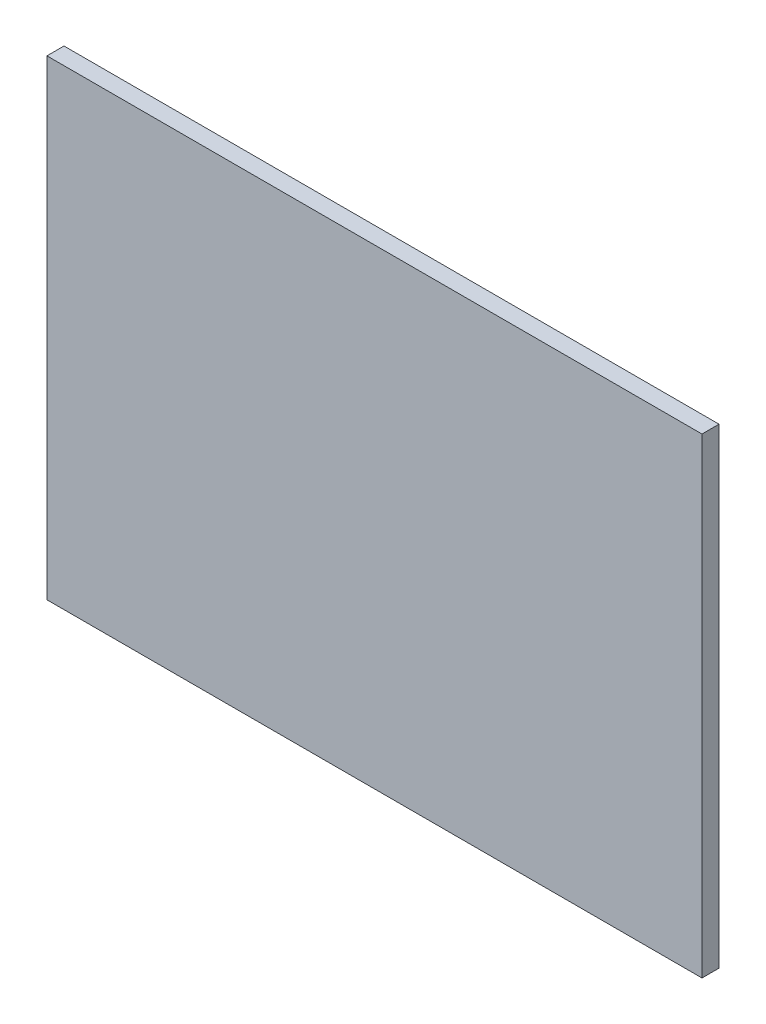
ISO-10303-21;
HEADER;
FILE_DESCRIPTION(('STEP AP214'),'2;1');
FILE_NAME('part.step','',(''),(''),'','','');
FILE_SCHEMA(('AUTOMOTIVE_DESIGN { 1 0 10303 214 1 1 1 1 }'));
ENDSEC;
DATA;
#1=APPLICATION_CONTEXT('core data for automotive mechanical design processes');
#2=APPLICATION_PROTOCOL_DEFINITION('international standard','automotive_design',2000,#1);
#3=PRODUCT_CONTEXT('',#1,'mechanical');
#4=PRODUCT('Part','Part','',(#3));
#5=PRODUCT_RELATED_PRODUCT_CATEGORY('part','',(#4));
#6=PRODUCT_DEFINITION_FORMATION('','',#4);
#7=PRODUCT_DEFINITION_CONTEXT('part definition',#1,'design');
#8=PRODUCT_DEFINITION('design','',#6,#7);
#9=PRODUCT_DEFINITION_SHAPE('','',#8);
#10=(LENGTH_UNIT() NAMED_UNIT(*) SI_UNIT(.MILLI.,.METRE.));
#11=(NAMED_UNIT(*) PLANE_ANGLE_UNIT() SI_UNIT($,.RADIAN.));
#12=(NAMED_UNIT(*) SI_UNIT($,.STERADIAN.) SOLID_ANGLE_UNIT());
#13=UNCERTAINTY_MEASURE_WITH_UNIT(LENGTH_MEASURE(1.E-05),#10,'distance_accuracy_value','');
#14=(GEOMETRIC_REPRESENTATION_CONTEXT(3) GLOBAL_UNCERTAINTY_ASSIGNED_CONTEXT((#13)) GLOBAL_UNIT_ASSIGNED_CONTEXT((#10,
#11,#12)) REPRESENTATION_CONTEXT('',''));
#15=CARTESIAN_POINT('',(0.,0.,0.));
#16=DIRECTION('',(0.,0.,1.));
#17=DIRECTION('',(1.,0.,0.));
#18=AXIS2_PLACEMENT_3D('',#15,#16,#17);
#19=CARTESIAN_POINT('',(-52.9649285951936,-15.9782466153098,3.16));
#20=DIRECTION('',(0.,1.,0.));
#21=DIRECTION('',(0.,0.,1.));
#22=AXIS2_PLACEMENT_3D('',#19,#20,#21);
#23=PLANE('',#22);
#24=DIRECTION('',(1.,0.,0.));
#25=VECTOR('',#24,1.);
#26=CARTESIAN_POINT('',(-52.9649285951936,-15.9782466153098,3.16));
#27=LINE('',#26,#25);
#28=CARTESIAN_POINT('',(-72.9649285951936,-15.9782466153098,3.16));
#29=VERTEX_POINT('',#28);
#30=CARTESIAN_POINT('',(48.5150714048065,-15.9782466153098,3.16));
#31=VERTEX_POINT('',#30);
#32=EDGE_CURVE('E43',#29,#31,#27,.T.);
#33=ORIENTED_EDGE('',*,*,#32,.F.);
#34=DIRECTION('',(0.,0.,-1.));
#35=VECTOR('',#34,1.);
#36=CARTESIAN_POINT('',(-72.9649285951936,-15.9782466153098,3.16));
#37=LINE('',#36,#35);
#38=CARTESIAN_POINT('',(-72.9649285951936,-15.9782466153098,0.));
#39=VERTEX_POINT('',#38);
#40=EDGE_CURVE('E101',#29,#39,#37,.T.);
#41=ORIENTED_EDGE('',*,*,#40,.T.);
#42=DIRECTION('',(1.,0.,0.));
#43=VECTOR('',#42,1.);
#44=CARTESIAN_POINT('',(-52.9649285951936,-15.9782466153098,0.));
#45=LINE('',#44,#43);
#46=CARTESIAN_POINT('',(48.5150714048065,-15.9782466153098,0.));
#47=VERTEX_POINT('',#46);
#48=EDGE_CURVE('E81',#39,#47,#45,.T.);
#49=ORIENTED_EDGE('',*,*,#48,.T.);
#50=DIRECTION('',(0.,0.,-1.));
#51=VECTOR('',#50,1.);
#52=CARTESIAN_POINT('',(48.5150714048065,-15.9782466153098,3.16));
#53=LINE('',#52,#51);
#54=EDGE_CURVE('E80',#31,#47,#53,.T.);
#55=ORIENTED_EDGE('',*,*,#54,.F.);
#56=EDGE_LOOP('',(#33,#41,#49,#55));
#57=FACE_BOUND('',#56,.T.);
#58=ADVANCED_FACE('F35',(#57),#23,.F.);
#59=CARTESIAN_POINT('',(-52.9649285951936,71.3917533846902,3.16));
#60=DIRECTION('',(0.,-1.,0.));
#61=DIRECTION('',(0.,0.,-1.));
#62=AXIS2_PLACEMENT_3D('',#59,#60,#61);
#63=PLANE('',#62);
#64=DIRECTION('',(-1.,0.,0.));
#65=VECTOR('',#64,1.);
#66=CARTESIAN_POINT('',(-52.9649285951936,71.3917533846902,0.));
#67=LINE('',#66,#65);
#68=CARTESIAN_POINT('',(48.5150714048065,71.3917533846902,0.));
#69=VERTEX_POINT('',#68);
#70=CARTESIAN_POINT('',(-72.9649285951936,71.3917533846902,0.));
#71=VERTEX_POINT('',#70);
#72=EDGE_CURVE('E38',#69,#71,#67,.T.);
#73=ORIENTED_EDGE('',*,*,#72,.T.);
#74=DIRECTION('',(0.,0.,-1.));
#75=VECTOR('',#74,1.);
#76=CARTESIAN_POINT('',(-72.9649285951936,71.3917533846902,3.16));
#77=LINE('',#76,#75);
#78=CARTESIAN_POINT('',(-72.9649285951936,71.3917533846902,3.16));
#79=VERTEX_POINT('',#78);
#80=EDGE_CURVE('E95',#79,#71,#77,.T.);
#81=ORIENTED_EDGE('',*,*,#80,.F.);
#82=DIRECTION('',(-1.,0.,0.));
#83=VECTOR('',#82,1.);
#84=CARTESIAN_POINT('',(-52.9649285951936,71.3917533846902,3.16));
#85=LINE('',#84,#83);
#86=CARTESIAN_POINT('',(48.5150714048065,71.3917533846902,3.16));
#87=VERTEX_POINT('',#86);
#88=EDGE_CURVE('E11',#87,#79,#85,.T.);
#89=ORIENTED_EDGE('',*,*,#88,.F.);
#90=DIRECTION('',(0.,0.,1.));
#91=VECTOR('',#90,1.);
#92=CARTESIAN_POINT('',(48.5150714048065,71.3917533846902,3.16));
#93=LINE('',#92,#91);
#94=EDGE_CURVE('E90',#69,#87,#93,.T.);
#95=ORIENTED_EDGE('',*,*,#94,.F.);
#96=EDGE_LOOP('',(#73,#81,#89,#95));
#97=FACE_BOUND('',#96,.T.);
#98=ADVANCED_FACE('F105',(#97),#63,.F.);
#99=CARTESIAN_POINT('',(0.,0.,3.16));
#100=DIRECTION('',(0.,0.,1.));
#101=DIRECTION('',(1.,0.,0.));
#102=AXIS2_PLACEMENT_3D('',#99,#100,#101);
#103=PLANE('',#102);
#104=ORIENTED_EDGE('',*,*,#88,.T.);
#105=DIRECTION('',(0.,-1.,0.));
#106=VECTOR('',#105,1.);
#107=CARTESIAN_POINT('',(-72.9649285951936,71.3917533846902,3.16));
#108=LINE('',#107,#106);
#109=EDGE_CURVE('E77',#79,#29,#108,.T.);
#110=ORIENTED_EDGE('',*,*,#109,.T.);
#111=ORIENTED_EDGE('',*,*,#32,.T.);
#112=DIRECTION('',(0.,-1.,0.));
#113=VECTOR('',#112,1.);
#114=CARTESIAN_POINT('',(48.5150714048065,71.3917533846902,3.16));
#115=LINE('',#114,#113);
#116=EDGE_CURVE('E75',#87,#31,#115,.T.);
#117=ORIENTED_EDGE('',*,*,#116,.F.);
#118=EDGE_LOOP('',(#104,#110,#111,#117));
#119=FACE_BOUND('',#118,.T.);
#120=ADVANCED_FACE('F73',(#119),#103,.T.);
#121=CARTESIAN_POINT('',(0.,0.,0.));
#122=DIRECTION('',(0.,0.,1.));
#123=DIRECTION('',(1.,0.,0.));
#124=AXIS2_PLACEMENT_3D('',#121,#122,#123);
#125=PLANE('',#124);
#126=ORIENTED_EDGE('',*,*,#48,.F.);
#127=DIRECTION('',(0.,-1.,0.));
#128=VECTOR('',#127,1.);
#129=CARTESIAN_POINT('',(-72.9649285951936,71.3917533846902,0.));
#130=LINE('',#129,#128);
#131=EDGE_CURVE('E98',#71,#39,#130,.T.);
#132=ORIENTED_EDGE('',*,*,#131,.F.);
#133=ORIENTED_EDGE('',*,*,#72,.F.);
#134=DIRECTION('',(0.,1.,0.));
#135=VECTOR('',#134,1.);
#136=CARTESIAN_POINT('',(48.5150714048065,71.3917533846902,0.));
#137=LINE('',#136,#135);
#138=EDGE_CURVE('E85',#47,#69,#137,.T.);
#139=ORIENTED_EDGE('',*,*,#138,.F.);
#140=EDGE_LOOP('',(#126,#132,#133,#139));
#141=FACE_BOUND('',#140,.T.);
#142=ADVANCED_FACE('F107',(#141),#125,.F.);
#143=CARTESIAN_POINT('',(-72.9649285951936,0.,0.));
#144=DIRECTION('',(-1.,0.,0.));
#145=DIRECTION('',(0.,-1.,0.));
#146=AXIS2_PLACEMENT_3D('',#143,#144,#145);
#147=PLANE('',#146);
#148=ORIENTED_EDGE('',*,*,#80,.T.);
#149=ORIENTED_EDGE('',*,*,#131,.T.);
#150=ORIENTED_EDGE('',*,*,#40,.F.);
#151=ORIENTED_EDGE('',*,*,#109,.F.);
#152=EDGE_LOOP('',(#148,#149,#150,#151));
#153=FACE_BOUND('',#152,.T.);
#154=ADVANCED_FACE('F109',(#153),#147,.T.);
#155=CARTESIAN_POINT('',(48.5150714048065,0.,0.));
#156=DIRECTION('',(1.,0.,0.));
#157=DIRECTION('',(0.,0.,-1.));
#158=AXIS2_PLACEMENT_3D('',#155,#156,#157);
#159=PLANE('',#158);
#160=ORIENTED_EDGE('',*,*,#116,.T.);
#161=ORIENTED_EDGE('',*,*,#54,.T.);
#162=ORIENTED_EDGE('',*,*,#138,.T.);
#163=ORIENTED_EDGE('',*,*,#94,.T.);
#164=EDGE_LOOP('',(#160,#161,#162,#163));
#165=FACE_BOUND('',#164,.T.);
#166=ADVANCED_FACE('F88',(#165),#159,.T.);
#167=CLOSED_SHELL('',(#58,#98,#120,#142,#154,#166));
#168=MANIFOLD_SOLID_BREP('B2',#167);
#169=ADVANCED_BREP_SHAPE_REPRESENTATION('',(#18,#168),#14);
#170=SHAPE_DEFINITION_REPRESENTATION(#9,#169);
ENDSEC;
END-ISO-10303-21;
